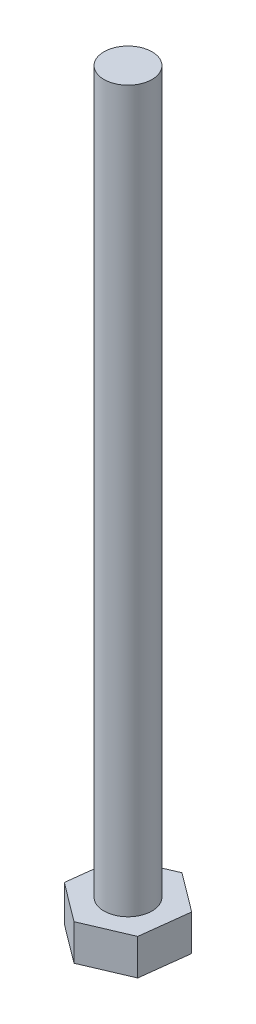
ISO-10303-21;
HEADER;
FILE_DESCRIPTION(('STEP AP214'),'2;1');
FILE_NAME('part.step','',(''),(''),'','','');
FILE_SCHEMA(('AUTOMOTIVE_DESIGN { 1 0 10303 214 1 1 1 1 }'));
ENDSEC;
DATA;
#1=APPLICATION_CONTEXT('core data for automotive mechanical design processes');
#2=APPLICATION_PROTOCOL_DEFINITION('international standard','automotive_design',2000,#1);
#3=PRODUCT_CONTEXT('',#1,'mechanical');
#4=PRODUCT('Part','Part','',(#3));
#5=PRODUCT_RELATED_PRODUCT_CATEGORY('part','',(#4));
#6=PRODUCT_DEFINITION_FORMATION('','',#4);
#7=PRODUCT_DEFINITION_CONTEXT('part definition',#1,'design');
#8=PRODUCT_DEFINITION('design','',#6,#7);
#9=PRODUCT_DEFINITION_SHAPE('','',#8);
#10=(LENGTH_UNIT() NAMED_UNIT(*) SI_UNIT(.MILLI.,.METRE.));
#11=(NAMED_UNIT(*) PLANE_ANGLE_UNIT() SI_UNIT($,.RADIAN.));
#12=(NAMED_UNIT(*) SI_UNIT($,.STERADIAN.) SOLID_ANGLE_UNIT());
#13=UNCERTAINTY_MEASURE_WITH_UNIT(LENGTH_MEASURE(1.E-05),#10,'distance_accuracy_value','');
#14=(GEOMETRIC_REPRESENTATION_CONTEXT(3) GLOBAL_UNCERTAINTY_ASSIGNED_CONTEXT((#13)) GLOBAL_UNIT_ASSIGNED_CONTEXT((#10,
#11,#12)) REPRESENTATION_CONTEXT('',''));
#15=CARTESIAN_POINT('',(0.,0.,0.));
#16=DIRECTION('',(0.,0.,1.));
#17=DIRECTION('',(1.,0.,0.));
#18=AXIS2_PLACEMENT_3D('',#15,#16,#17);
#19=CARTESIAN_POINT('',(-0.483419246269011,3.,4.01243556529822));
#20=DIRECTION('',(-0.39282032302756,0.,-0.919615242270659));
#21=DIRECTION('',(-0.919615242270659,0.,0.39282032302756));
#22=AXIS2_PLACEMENT_3D('',#19,#20,#21);
#23=PLANE('',#22);
#24=DIRECTION('',(0.919615242270659,0.,-0.39282032302756));
#25=VECTOR('',#24,1.);
#26=CARTESIAN_POINT('',(-0.483419246269011,0.,4.01243556529822));
#27=LINE('',#26,#25);
#28=CARTESIAN_POINT('',(-0.483419246269011,0.,4.01243556529822));
#29=VERTEX_POINT('',#28);
#30=CARTESIAN_POINT('',(3.23316150746193,0.,2.4248711305964));
#31=VERTEX_POINT('',#30);
#32=EDGE_CURVE('E130',#29,#31,#27,.T.);
#33=ORIENTED_EDGE('',*,*,#32,.T.);
#34=DIRECTION('',(0.,-1.,0.));
#35=VECTOR('',#34,1.);
#36=CARTESIAN_POINT('',(3.23316150746193,3.,2.4248711305964));
#37=LINE('',#36,#35);
#38=CARTESIAN_POINT('',(3.23316150746193,3.,2.4248711305964));
#39=VERTEX_POINT('',#38);
#40=EDGE_CURVE('E42',#39,#31,#37,.T.);
#41=ORIENTED_EDGE('',*,*,#40,.F.);
#42=DIRECTION('',(0.919615242270659,0.,-0.39282032302756));
#43=VECTOR('',#42,1.);
#44=CARTESIAN_POINT('',(-0.483419246269011,3.,4.01243556529822));
#45=LINE('',#44,#43);
#46=CARTESIAN_POINT('',(-0.483419246269011,3.,4.01243556529822));
#47=VERTEX_POINT('',#46);
#48=EDGE_CURVE('E147',#47,#39,#45,.T.);
#49=ORIENTED_EDGE('',*,*,#48,.F.);
#50=DIRECTION('',(0.,-1.,0.));
#51=VECTOR('',#50,1.);
#52=CARTESIAN_POINT('',(-0.483419246269011,3.,4.01243556529822));
#53=LINE('',#52,#51);
#54=EDGE_CURVE('E126',#47,#29,#53,.T.);
#55=ORIENTED_EDGE('',*,*,#54,.T.);
#56=EDGE_LOOP('',(#33,#41,#49,#55));
#57=FACE_BOUND('',#56,.T.);
#58=ADVANCED_FACE('F39',(#57),#23,.F.);
#59=CARTESIAN_POINT('',(3.23316150746193,3.,2.4248711305964));
#60=DIRECTION('',(-0.992820323027552,0.,-0.119615242270654));
#61=DIRECTION('',(-0.119615242270654,0.,0.992820323027552));
#62=AXIS2_PLACEMENT_3D('',#59,#60,#61);
#63=PLANE('',#62);
#64=DIRECTION('',(0.119615242270654,0.,-0.992820323027552));
#65=VECTOR('',#64,1.);
#66=CARTESIAN_POINT('',(3.23316150746193,0.,2.4248711305964));
#67=LINE('',#66,#65);
#68=CARTESIAN_POINT('',(3.71658075373094,0.,-1.58756443470182));
#69=VERTEX_POINT('',#68);
#70=EDGE_CURVE('E134',#31,#69,#67,.T.);
#71=ORIENTED_EDGE('',*,*,#70,.T.);
#72=DIRECTION('',(0.,-1.,0.));
#73=VECTOR('',#72,1.);
#74=CARTESIAN_POINT('',(3.71658075373094,3.,-1.58756443470182));
#75=LINE('',#74,#73);
#76=CARTESIAN_POINT('',(3.71658075373094,3.,-1.58756443470182));
#77=VERTEX_POINT('',#76);
#78=EDGE_CURVE('E153',#77,#69,#75,.T.);
#79=ORIENTED_EDGE('',*,*,#78,.F.);
#80=DIRECTION('',(0.119615242270654,0.,-0.992820323027552));
#81=VECTOR('',#80,1.);
#82=CARTESIAN_POINT('',(3.23316150746193,3.,2.4248711305964));
#83=LINE('',#82,#81);
#84=EDGE_CURVE('E95',#39,#77,#83,.T.);
#85=ORIENTED_EDGE('',*,*,#84,.F.);
#86=ORIENTED_EDGE('',*,*,#40,.T.);
#87=EDGE_LOOP('',(#71,#79,#85,#86));
#88=FACE_BOUND('',#87,.T.);
#89=ADVANCED_FACE('F160',(#88),#63,.F.);
#90=CARTESIAN_POINT('',(3.71658075373094,3.,-1.58756443470182));
#91=DIRECTION('',(-0.599999999999992,0.,0.800000000000006));
#92=DIRECTION('',(0.800000000000006,0.,0.599999999999992));
#93=AXIS2_PLACEMENT_3D('',#90,#91,#92);
#94=PLANE('',#93);
#95=DIRECTION('',(-0.800000000000006,0.,-0.599999999999992));
#96=VECTOR('',#95,1.);
#97=CARTESIAN_POINT('',(3.71658075373094,0.,-1.58756443470182));
#98=LINE('',#97,#96);
#99=CARTESIAN_POINT('',(0.483419246269011,0.,-4.01243556529822));
#100=VERTEX_POINT('',#99);
#101=EDGE_CURVE('E138',#69,#100,#98,.T.);
#102=ORIENTED_EDGE('',*,*,#101,.T.);
#103=DIRECTION('',(0.,-1.,0.));
#104=VECTOR('',#103,1.);
#105=CARTESIAN_POINT('',(0.483419246269011,3.,-4.01243556529822));
#106=LINE('',#105,#104);
#107=CARTESIAN_POINT('',(0.483419246269011,3.,-4.01243556529822));
#108=VERTEX_POINT('',#107);
#109=EDGE_CURVE('E119',#108,#100,#106,.T.);
#110=ORIENTED_EDGE('',*,*,#109,.F.);
#111=DIRECTION('',(-0.800000000000006,0.,-0.599999999999992));
#112=VECTOR('',#111,1.);
#113=CARTESIAN_POINT('',(3.71658075373094,3.,-1.58756443470182));
#114=LINE('',#113,#112);
#115=EDGE_CURVE('E108',#77,#108,#114,.T.);
#116=ORIENTED_EDGE('',*,*,#115,.F.);
#117=ORIENTED_EDGE('',*,*,#78,.T.);
#118=EDGE_LOOP('',(#102,#110,#116,#117));
#119=FACE_BOUND('',#118,.T.);
#120=ADVANCED_FACE('F166',(#119),#94,.F.);
#121=CARTESIAN_POINT('',(0.483419246269011,3.,-4.01243556529822));
#122=DIRECTION('',(0.392820323027559,0.,0.91961524227066));
#123=DIRECTION('',(0.91961524227066,0.,-0.392820323027559));
#124=AXIS2_PLACEMENT_3D('',#121,#122,#123);
#125=PLANE('',#124);
#126=DIRECTION('',(-0.91961524227066,0.,0.392820323027559));
#127=VECTOR('',#126,1.);
#128=CARTESIAN_POINT('',(0.483419246269011,0.,-4.01243556529822));
#129=LINE('',#128,#127);
#130=CARTESIAN_POINT('',(-3.23316150746193,0.,-2.4248711305964));
#131=VERTEX_POINT('',#130);
#132=EDGE_CURVE('E117',#100,#131,#129,.T.);
#133=ORIENTED_EDGE('',*,*,#132,.T.);
#134=DIRECTION('',(0.,-1.,0.));
#135=VECTOR('',#134,1.);
#136=CARTESIAN_POINT('',(-3.23316150746193,3.,-2.4248711305964));
#137=LINE('',#136,#135);
#138=CARTESIAN_POINT('',(-3.23316150746193,3.,-2.4248711305964));
#139=VERTEX_POINT('',#138);
#140=EDGE_CURVE('E114',#139,#131,#137,.T.);
#141=ORIENTED_EDGE('',*,*,#140,.F.);
#142=DIRECTION('',(-0.91961524227066,0.,0.392820323027559));
#143=VECTOR('',#142,1.);
#144=CARTESIAN_POINT('',(0.483419246269011,3.,-4.01243556529822));
#145=LINE('',#144,#143);
#146=EDGE_CURVE('E102',#108,#139,#145,.T.);
#147=ORIENTED_EDGE('',*,*,#146,.F.);
#148=ORIENTED_EDGE('',*,*,#109,.T.);
#149=EDGE_LOOP('',(#133,#141,#147,#148));
#150=FACE_BOUND('',#149,.T.);
#151=ADVANCED_FACE('F115',(#150),#125,.F.);
#152=CARTESIAN_POINT('',(-3.23316150746193,3.,-2.4248711305964));
#153=DIRECTION('',(0.992820323027552,0.,0.119615242270654));
#154=DIRECTION('',(0.119615242270654,0.,-0.992820323027552));
#155=AXIS2_PLACEMENT_3D('',#152,#153,#154);
#156=PLANE('',#155);
#157=DIRECTION('',(-0.119615242270654,0.,0.992820323027552));
#158=VECTOR('',#157,1.);
#159=CARTESIAN_POINT('',(-3.23316150746193,0.,-2.4248711305964));
#160=LINE('',#159,#158);
#161=CARTESIAN_POINT('',(-3.71658075373094,0.,1.58756443470182));
#162=VERTEX_POINT('',#161);
#163=EDGE_CURVE('E80',#131,#162,#160,.T.);
#164=ORIENTED_EDGE('',*,*,#163,.T.);
#165=DIRECTION('',(0.,-1.,0.));
#166=VECTOR('',#165,1.);
#167=CARTESIAN_POINT('',(-3.71658075373094,3.,1.58756443470182));
#168=LINE('',#167,#166);
#169=CARTESIAN_POINT('',(-3.71658075373094,3.,1.58756443470182));
#170=VERTEX_POINT('',#169);
#171=EDGE_CURVE('E120',#170,#162,#168,.T.);
#172=ORIENTED_EDGE('',*,*,#171,.F.);
#173=DIRECTION('',(-0.119615242270654,0.,0.992820323027552));
#174=VECTOR('',#173,1.);
#175=CARTESIAN_POINT('',(-3.23316150746193,3.,-2.4248711305964));
#176=LINE('',#175,#174);
#177=EDGE_CURVE('E106',#139,#170,#176,.T.);
#178=ORIENTED_EDGE('',*,*,#177,.F.);
#179=ORIENTED_EDGE('',*,*,#140,.T.);
#180=EDGE_LOOP('',(#164,#172,#178,#179));
#181=FACE_BOUND('',#180,.T.);
#182=ADVANCED_FACE('F122',(#181),#156,.F.);
#183=CARTESIAN_POINT('',(-3.71658075373094,3.,1.58756443470182));
#184=DIRECTION('',(0.599999999999993,0.,-0.800000000000005));
#185=DIRECTION('',(-0.800000000000006,0.,-0.599999999999993));
#186=AXIS2_PLACEMENT_3D('',#183,#184,#185);
#187=PLANE('',#186);
#188=DIRECTION('',(0.800000000000005,0.,0.599999999999993));
#189=VECTOR('',#188,1.);
#190=CARTESIAN_POINT('',(-3.71658075373094,0.,1.58756443470182));
#191=LINE('',#190,#189);
#192=EDGE_CURVE('E86',#162,#29,#191,.T.);
#193=ORIENTED_EDGE('',*,*,#192,.T.);
#194=ORIENTED_EDGE('',*,*,#54,.F.);
#195=DIRECTION('',(0.800000000000005,0.,0.599999999999993));
#196=VECTOR('',#195,1.);
#197=CARTESIAN_POINT('',(-3.71658075373094,3.,1.58756443470182));
#198=LINE('',#197,#196);
#199=EDGE_CURVE('E57',#170,#47,#198,.T.);
#200=ORIENTED_EDGE('',*,*,#199,.F.);
#201=ORIENTED_EDGE('',*,*,#171,.T.);
#202=EDGE_LOOP('',(#193,#194,#200,#201));
#203=FACE_BOUND('',#202,.T.);
#204=ADVANCED_FACE('F186',(#203),#187,.F.);
#205=CARTESIAN_POINT('',(0.,3.,0.));
#206=DIRECTION('',(0.,1.,0.));
#207=DIRECTION('',(0.,0.,1.));
#208=AXIS2_PLACEMENT_3D('',#205,#206,#207);
#209=PLANE('',#208);
#210=CARTESIAN_POINT('',(0.,3.,0.));
#211=DIRECTION('',(0.,1.,0.));
#212=DIRECTION('',(0.,0.,1.));
#213=AXIS2_PLACEMENT_3D('',#210,#211,#212);
#214=CIRCLE('',#213,2.);
#215=CARTESIAN_POINT('',(0.,3.,2.));
#216=VERTEX_POINT('',#215);
#217=EDGE_CURVE('E11',#216,#216,#214,.T.);
#218=ORIENTED_EDGE('',*,*,#217,.F.);
#219=EDGE_LOOP('',(#218));
#220=FACE_BOUND('',#219,.T.);
#221=ORIENTED_EDGE('',*,*,#48,.T.);
#222=ORIENTED_EDGE('',*,*,#84,.T.);
#223=ORIENTED_EDGE('',*,*,#115,.T.);
#224=ORIENTED_EDGE('',*,*,#146,.T.);
#225=ORIENTED_EDGE('',*,*,#177,.T.);
#226=ORIENTED_EDGE('',*,*,#199,.T.);
#227=EDGE_LOOP('',(#221,#222,#223,#224,#225,#226));
#228=FACE_BOUND('',#227,.T.);
#229=ADVANCED_FACE('F104',(#220,#228),#209,.T.);
#230=CARTESIAN_POINT('',(0.,0.,0.));
#231=DIRECTION('',(0.,1.,0.));
#232=DIRECTION('',(0.,0.,1.));
#233=AXIS2_PLACEMENT_3D('',#230,#231,#232);
#234=PLANE('',#233);
#235=ORIENTED_EDGE('',*,*,#32,.F.);
#236=ORIENTED_EDGE('',*,*,#192,.F.);
#237=ORIENTED_EDGE('',*,*,#163,.F.);
#238=ORIENTED_EDGE('',*,*,#132,.F.);
#239=ORIENTED_EDGE('',*,*,#101,.F.);
#240=ORIENTED_EDGE('',*,*,#70,.F.);
#241=EDGE_LOOP('',(#235,#236,#237,#238,#239,#240));
#242=FACE_BOUND('',#241,.T.);
#243=ADVANCED_FACE('F165',(#242),#234,.F.);
#244=CARTESIAN_POINT('',(0.,63.,0.));
#245=DIRECTION('',(0.,-1.,0.));
#246=DIRECTION('',(0.,0.,-1.));
#247=AXIS2_PLACEMENT_3D('',#244,#245,#246);
#248=CYLINDRICAL_SURFACE('',#247,2.);
#249=CARTESIAN_POINT('',(0.,63.,0.));
#250=DIRECTION('',(0.,1.,0.));
#251=DIRECTION('',(0.,0.,1.));
#252=AXIS2_PLACEMENT_3D('',#249,#250,#251);
#253=CIRCLE('',#252,2.);
#254=CARTESIAN_POINT('',(0.,63.,2.));
#255=VERTEX_POINT('',#254);
#256=EDGE_CURVE('E135',#255,#255,#253,.T.);
#257=ORIENTED_EDGE('',*,*,#256,.F.);
#258=EDGE_LOOP('',(#257));
#259=FACE_BOUND('',#258,.T.);
#260=ORIENTED_EDGE('',*,*,#217,.T.);
#261=EDGE_LOOP('',(#260));
#262=FACE_BOUND('',#261,.T.);
#263=ADVANCED_FACE('F179',(#259,#262),#248,.T.);
#264=CARTESIAN_POINT('',(0.,63.,0.));
#265=DIRECTION('',(0.,1.,0.));
#266=DIRECTION('',(0.,0.,1.));
#267=AXIS2_PLACEMENT_3D('',#264,#265,#266);
#268=PLANE('',#267);
#269=ORIENTED_EDGE('',*,*,#256,.T.);
#270=EDGE_LOOP('',(#269));
#271=FACE_BOUND('',#270,.T.);
#272=ADVANCED_FACE('F177',(#271),#268,.T.);
#273=CLOSED_SHELL('',(#58,#89,#120,#151,#182,#204,#229,#243,#263,#272));
#274=MANIFOLD_SOLID_BREP('B2',#273);
#275=ADVANCED_BREP_SHAPE_REPRESENTATION('',(#18,#274),#14);
#276=SHAPE_DEFINITION_REPRESENTATION(#9,#275);
ENDSEC;
END-ISO-10303-21;
